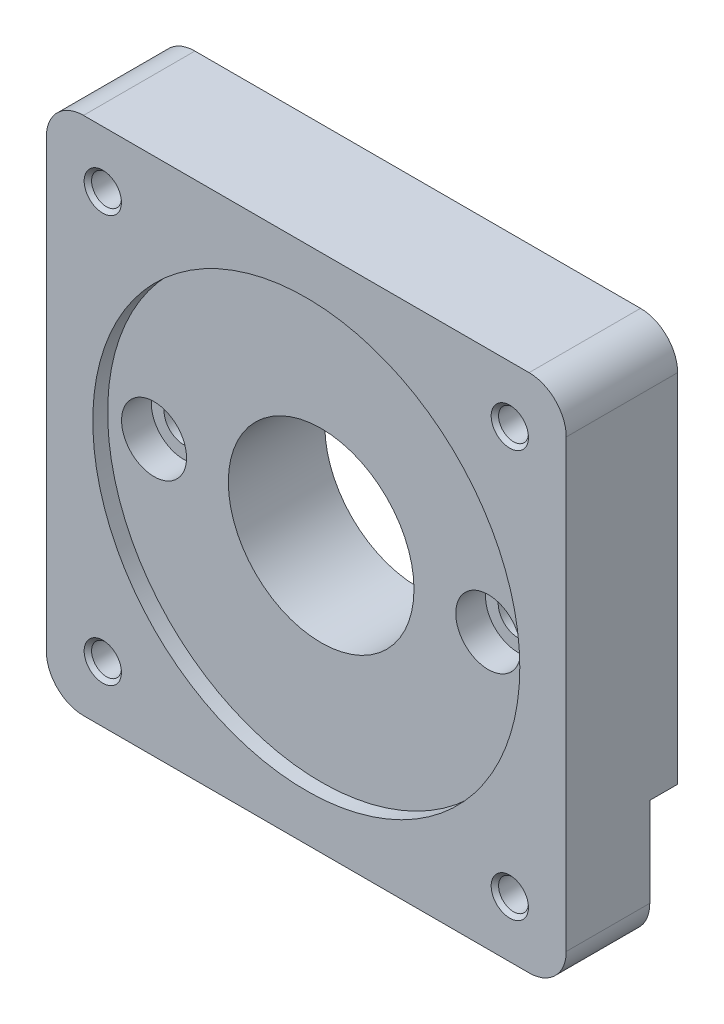
ISO-10303-21;
HEADER;
FILE_DESCRIPTION(('STEP AP214'),'2;1');
FILE_NAME('part.step','',(''),(''),'','','');
FILE_SCHEMA(('AUTOMOTIVE_DESIGN { 1 0 10303 214 1 1 1 1 }'));
ENDSEC;
DATA;
#1=APPLICATION_CONTEXT('core data for automotive mechanical design processes');
#2=APPLICATION_PROTOCOL_DEFINITION('international standard','automotive_design',2000,#1);
#3=PRODUCT_CONTEXT('',#1,'mechanical');
#4=PRODUCT('Part','Part','',(#3));
#5=PRODUCT_RELATED_PRODUCT_CATEGORY('part','',(#4));
#6=PRODUCT_DEFINITION_FORMATION('','',#4);
#7=PRODUCT_DEFINITION_CONTEXT('part definition',#1,'design');
#8=PRODUCT_DEFINITION('design','',#6,#7);
#9=PRODUCT_DEFINITION_SHAPE('','',#8);
#10=(LENGTH_UNIT() NAMED_UNIT(*) SI_UNIT(.MILLI.,.METRE.));
#11=(NAMED_UNIT(*) PLANE_ANGLE_UNIT() SI_UNIT($,.RADIAN.));
#12=(NAMED_UNIT(*) SI_UNIT($,.STERADIAN.) SOLID_ANGLE_UNIT());
#13=UNCERTAINTY_MEASURE_WITH_UNIT(LENGTH_MEASURE(1.E-05),#10,'distance_accuracy_value','');
#14=(GEOMETRIC_REPRESENTATION_CONTEXT(3) GLOBAL_UNCERTAINTY_ASSIGNED_CONTEXT((#13)) GLOBAL_UNIT_ASSIGNED_CONTEXT((#10,
#11,#12)) REPRESENTATION_CONTEXT('',''));
#15=CARTESIAN_POINT('',(0.,0.,0.));
#16=DIRECTION('',(0.,0.,1.));
#17=DIRECTION('',(1.,0.,0.));
#18=AXIS2_PLACEMENT_3D('',#15,#16,#17);
#19=CARTESIAN_POINT('',(44.45,44.45,19.05));
#20=DIRECTION('',(-1.,0.,0.));
#21=DIRECTION('',(0.,-1.,0.));
#22=AXIS2_PLACEMENT_3D('',#19,#20,#21);
#23=PLANE('',#22);
#24=DIRECTION('',(0.,1.,0.));
#25=VECTOR('',#24,1.);
#26=CARTESIAN_POINT('',(44.45,44.45,19.05));
#27=LINE('',#26,#25);
#28=CARTESIAN_POINT('',(44.45,-38.1,19.05));
#29=VERTEX_POINT('',#28);
#30=CARTESIAN_POINT('',(44.45,38.1,19.05));
#31=VERTEX_POINT('',#30);
#32=EDGE_CURVE('E160',#29,#31,#27,.T.);
#33=ORIENTED_EDGE('',*,*,#32,.F.);
#34=DIRECTION('',(0.,0.,-1.));
#35=VECTOR('',#34,1.);
#36=CARTESIAN_POINT('',(44.45,-38.1,19.05));
#37=LINE('',#36,#35);
#38=CARTESIAN_POINT('',(44.45,-38.1,4.7625));
#39=VERTEX_POINT('',#38);
#40=EDGE_CURVE('E121',#29,#39,#37,.T.);
#41=ORIENTED_EDGE('',*,*,#40,.T.);
#42=DIRECTION('',(0.,1.,0.));
#43=VECTOR('',#42,1.);
#44=CARTESIAN_POINT('',(44.45,-44.45,4.7625));
#45=LINE('',#44,#43);
#46=CARTESIAN_POINT('',(44.45,-22.86,4.7625));
#47=VERTEX_POINT('',#46);
#48=EDGE_CURVE('E113',#39,#47,#45,.T.);
#49=ORIENTED_EDGE('',*,*,#48,.T.);
#50=DIRECTION('',(0.,0.,-1.));
#51=VECTOR('',#50,1.);
#52=CARTESIAN_POINT('',(44.45,-22.86,0.));
#53=LINE('',#52,#51);
#54=CARTESIAN_POINT('',(44.45,-22.86,0.));
#55=VERTEX_POINT('',#54);
#56=EDGE_CURVE('E118',#47,#55,#53,.T.);
#57=ORIENTED_EDGE('',*,*,#56,.T.);
#58=DIRECTION('',(0.,1.,0.));
#59=VECTOR('',#58,1.);
#60=CARTESIAN_POINT('',(44.45,44.45,0.));
#61=LINE('',#60,#59);
#62=CARTESIAN_POINT('',(44.45,38.1,0.));
#63=VERTEX_POINT('',#62);
#64=EDGE_CURVE('E157',#55,#63,#61,.T.);
#65=ORIENTED_EDGE('',*,*,#64,.T.);
#66=DIRECTION('',(0.,0.,-1.));
#67=VECTOR('',#66,1.);
#68=CARTESIAN_POINT('',(44.45,38.1,19.05));
#69=LINE('',#68,#67);
#70=EDGE_CURVE('E199',#63,#31,#69,.F.);
#71=ORIENTED_EDGE('',*,*,#70,.T.);
#72=EDGE_LOOP('',(#33,#41,#49,#57,#65,#71));
#73=FACE_BOUND('',#72,.T.);
#74=ADVANCED_FACE('F34',(#73),#23,.F.);
#75=CARTESIAN_POINT('',(-44.45,44.45,19.05));
#76=DIRECTION('',(0.,-1.,0.));
#77=DIRECTION('',(0.,0.,-1.));
#78=AXIS2_PLACEMENT_3D('',#75,#76,#77);
#79=PLANE('',#78);
#80=DIRECTION('',(-1.,0.,0.));
#81=VECTOR('',#80,1.);
#82=CARTESIAN_POINT('',(-44.45,44.45,19.05));
#83=LINE('',#82,#81);
#84=CARTESIAN_POINT('',(38.1,44.45,19.05));
#85=VERTEX_POINT('',#84);
#86=CARTESIAN_POINT('',(-38.1,44.45,19.05));
#87=VERTEX_POINT('',#86);
#88=EDGE_CURVE('E163',#85,#87,#83,.T.);
#89=ORIENTED_EDGE('',*,*,#88,.F.);
#90=DIRECTION('',(0.,0.,-1.));
#91=VECTOR('',#90,1.);
#92=CARTESIAN_POINT('',(38.1,44.45,19.05));
#93=LINE('',#92,#91);
#94=CARTESIAN_POINT('',(38.1,44.45,0.));
#95=VERTEX_POINT('',#94);
#96=EDGE_CURVE('E204',#85,#95,#93,.T.);
#97=ORIENTED_EDGE('',*,*,#96,.T.);
#98=DIRECTION('',(-1.,0.,0.));
#99=VECTOR('',#98,1.);
#100=CARTESIAN_POINT('',(-44.45,44.45,0.));
#101=LINE('',#100,#99);
#102=CARTESIAN_POINT('',(-38.1,44.45,0.));
#103=VERTEX_POINT('',#102);
#104=EDGE_CURVE('E175',#95,#103,#101,.T.);
#105=ORIENTED_EDGE('',*,*,#104,.T.);
#106=DIRECTION('',(0.,0.,-1.));
#107=VECTOR('',#106,1.);
#108=CARTESIAN_POINT('',(-38.1,44.45,19.05));
#109=LINE('',#108,#107);
#110=EDGE_CURVE('E202',#103,#87,#109,.F.);
#111=ORIENTED_EDGE('',*,*,#110,.T.);
#112=EDGE_LOOP('',(#89,#97,#105,#111));
#113=FACE_BOUND('',#112,.T.);
#114=ADVANCED_FACE('F312',(#113),#79,.F.);
#115=CARTESIAN_POINT('',(-44.45,44.45,19.05));
#116=DIRECTION('',(1.,0.,0.));
#117=DIRECTION('',(0.,1.,0.));
#118=AXIS2_PLACEMENT_3D('',#115,#116,#117);
#119=PLANE('',#118);
#120=DIRECTION('',(0.,1.,0.));
#121=VECTOR('',#120,1.);
#122=CARTESIAN_POINT('',(-44.45,-44.45,4.7625));
#123=LINE('',#122,#121);
#124=CARTESIAN_POINT('',(-44.45,-38.1,4.7625));
#125=VERTEX_POINT('',#124);
#126=CARTESIAN_POINT('',(-44.45,-22.86,4.7625));
#127=VERTEX_POINT('',#126);
#128=EDGE_CURVE('E130',#125,#127,#123,.T.);
#129=ORIENTED_EDGE('',*,*,#128,.F.);
#130=DIRECTION('',(0.,0.,-1.));
#131=VECTOR('',#130,1.);
#132=CARTESIAN_POINT('',(-44.45,-38.1,19.05));
#133=LINE('',#132,#131);
#134=CARTESIAN_POINT('',(-44.45,-38.1,19.05));
#135=VERTEX_POINT('',#134);
#136=EDGE_CURVE('E189',#125,#135,#133,.F.);
#137=ORIENTED_EDGE('',*,*,#136,.T.);
#138=DIRECTION('',(0.,-1.,0.));
#139=VECTOR('',#138,1.);
#140=CARTESIAN_POINT('',(-44.45,44.45,19.05));
#141=LINE('',#140,#139);
#142=CARTESIAN_POINT('',(-44.45,38.1,19.05));
#143=VERTEX_POINT('',#142);
#144=EDGE_CURVE('E167',#143,#135,#141,.T.);
#145=ORIENTED_EDGE('',*,*,#144,.F.);
#146=DIRECTION('',(0.,0.,-1.));
#147=VECTOR('',#146,1.);
#148=CARTESIAN_POINT('',(-44.45,38.1,19.05));
#149=LINE('',#148,#147);
#150=CARTESIAN_POINT('',(-44.45,38.1,0.));
#151=VERTEX_POINT('',#150);
#152=EDGE_CURVE('E186',#143,#151,#149,.T.);
#153=ORIENTED_EDGE('',*,*,#152,.T.);
#154=DIRECTION('',(0.,-1.,0.));
#155=VECTOR('',#154,1.);
#156=CARTESIAN_POINT('',(-44.45,44.45,0.));
#157=LINE('',#156,#155);
#158=CARTESIAN_POINT('',(-44.45,-22.86,0.));
#159=VERTEX_POINT('',#158);
#160=EDGE_CURVE('E164',#151,#159,#157,.T.);
#161=ORIENTED_EDGE('',*,*,#160,.T.);
#162=DIRECTION('',(0.,0.,-1.));
#163=VECTOR('',#162,1.);
#164=CARTESIAN_POINT('',(-44.45,-22.86,0.));
#165=LINE('',#164,#163);
#166=EDGE_CURVE('E123',#127,#159,#165,.T.);
#167=ORIENTED_EDGE('',*,*,#166,.F.);
#168=EDGE_LOOP('',(#129,#137,#145,#153,#161,#167));
#169=FACE_BOUND('',#168,.T.);
#170=ADVANCED_FACE('F315',(#169),#119,.F.);
#171=CARTESIAN_POINT('',(-44.45,-44.45,19.05));
#172=DIRECTION('',(0.,1.,0.));
#173=DIRECTION('',(0.,0.,1.));
#174=AXIS2_PLACEMENT_3D('',#171,#172,#173);
#175=PLANE('',#174);
#176=DIRECTION('',(1.,0.,0.));
#177=VECTOR('',#176,1.);
#178=CARTESIAN_POINT('',(-44.45,-44.45,19.05));
#179=LINE('',#178,#177);
#180=CARTESIAN_POINT('',(-38.1,-44.45,19.05));
#181=VERTEX_POINT('',#180);
#182=CARTESIAN_POINT('',(38.1,-44.45,19.05));
#183=VERTEX_POINT('',#182);
#184=EDGE_CURVE('E170',#181,#183,#179,.T.);
#185=ORIENTED_EDGE('',*,*,#184,.F.);
#186=DIRECTION('',(0.,0.,-1.));
#187=VECTOR('',#186,1.);
#188=CARTESIAN_POINT('',(-38.1,-44.45,19.05));
#189=LINE('',#188,#187);
#190=CARTESIAN_POINT('',(-38.1,-44.45,4.7625));
#191=VERTEX_POINT('',#190);
#192=EDGE_CURVE('E179',#181,#191,#189,.T.);
#193=ORIENTED_EDGE('',*,*,#192,.T.);
#194=DIRECTION('',(-1.,0.,0.));
#195=VECTOR('',#194,1.);
#196=CARTESIAN_POINT('',(44.45,-44.45,4.7625));
#197=LINE('',#196,#195);
#198=CARTESIAN_POINT('',(38.1,-44.45,4.7625));
#199=VERTEX_POINT('',#198);
#200=EDGE_CURVE('E135',#199,#191,#197,.T.);
#201=ORIENTED_EDGE('',*,*,#200,.F.);
#202=DIRECTION('',(0.,0.,-1.));
#203=VECTOR('',#202,1.);
#204=CARTESIAN_POINT('',(38.1,-44.45,19.05));
#205=LINE('',#204,#203);
#206=EDGE_CURVE('E173',#199,#183,#205,.F.);
#207=ORIENTED_EDGE('',*,*,#206,.T.);
#208=EDGE_LOOP('',(#185,#193,#201,#207));
#209=FACE_BOUND('',#208,.T.);
#210=ADVANCED_FACE('F287',(#209),#175,.F.);
#211=CARTESIAN_POINT('',(0.,0.,19.05));
#212=DIRECTION('',(0.,0.,1.));
#213=DIRECTION('',(1.,0.,0.));
#214=AXIS2_PLACEMENT_3D('',#211,#212,#213);
#215=PLANE('',#214);
#216=CARTESIAN_POINT('',(34.8,-34.8,19.05));
#217=DIRECTION('',(0.,0.,1.));
#218=DIRECTION('',(1.,0.,0.));
#219=AXIS2_PLACEMENT_3D('',#216,#217,#218);
#220=CIRCLE('',#219,3.1877);
#221=CARTESIAN_POINT('',(37.9877,-34.8,19.05));
#222=VERTEX_POINT('',#221);
#223=EDGE_CURVE('E213',#222,#222,#220,.T.);
#224=ORIENTED_EDGE('',*,*,#223,.F.);
#225=EDGE_LOOP('',(#224));
#226=FACE_BOUND('',#225,.T.);
#227=CARTESIAN_POINT('',(-34.8,34.8,19.05));
#228=DIRECTION('',(0.,0.,1.));
#229=DIRECTION('',(1.,0.,0.));
#230=AXIS2_PLACEMENT_3D('',#227,#228,#229);
#231=CIRCLE('',#230,3.1877);
#232=CARTESIAN_POINT('',(-31.6123,34.8,19.05));
#233=VERTEX_POINT('',#232);
#234=EDGE_CURVE('E236',#233,#233,#231,.T.);
#235=ORIENTED_EDGE('',*,*,#234,.F.);
#236=EDGE_LOOP('',(#235));
#237=FACE_BOUND('',#236,.T.);
#238=CARTESIAN_POINT('',(-34.8,-34.8,19.05));
#239=DIRECTION('',(0.,0.,1.));
#240=DIRECTION('',(1.,0.,0.));
#241=AXIS2_PLACEMENT_3D('',#238,#239,#240);
#242=CIRCLE('',#241,3.1877);
#243=CARTESIAN_POINT('',(-31.6123,-34.8,19.05));
#244=VERTEX_POINT('',#243);
#245=EDGE_CURVE('E248',#244,#244,#242,.T.);
#246=ORIENTED_EDGE('',*,*,#245,.F.);
#247=EDGE_LOOP('',(#246));
#248=FACE_BOUND('',#247,.T.);
#249=CARTESIAN_POINT('',(34.8,34.8,19.05));
#250=DIRECTION('',(0.,0.,1.));
#251=DIRECTION('',(1.,0.,0.));
#252=AXIS2_PLACEMENT_3D('',#249,#250,#251);
#253=CIRCLE('',#252,3.1877);
#254=CARTESIAN_POINT('',(37.9877,34.8,19.05));
#255=VERTEX_POINT('',#254);
#256=EDGE_CURVE('E260',#255,#255,#253,.T.);
#257=ORIENTED_EDGE('',*,*,#256,.F.);
#258=EDGE_LOOP('',(#257));
#259=FACE_BOUND('',#258,.T.);
#260=CARTESIAN_POINT('',(0.,0.,19.05));
#261=DIRECTION('',(0.,0.,1.));
#262=DIRECTION('',(1.,0.,0.));
#263=AXIS2_PLACEMENT_3D('',#260,#261,#262);
#264=CIRCLE('',#263,36.51);
#265=CARTESIAN_POINT('',(36.51,0.,19.05));
#266=VERTEX_POINT('',#265);
#267=EDGE_CURVE('E151',#266,#266,#264,.T.);
#268=ORIENTED_EDGE('',*,*,#267,.F.);
#269=EDGE_LOOP('',(#268));
#270=FACE_BOUND('',#269,.T.);
#271=ORIENTED_EDGE('',*,*,#144,.T.);
#272=CARTESIAN_POINT('',(-38.1,-38.1,19.05));
#273=DIRECTION('',(0.,0.,1.));
#274=DIRECTION('',(1.,0.,0.));
#275=AXIS2_PLACEMENT_3D('',#272,#273,#274);
#276=CIRCLE('',#275,6.35);
#277=EDGE_CURVE('E197',#135,#181,#276,.T.);
#278=ORIENTED_EDGE('',*,*,#277,.T.);
#279=ORIENTED_EDGE('',*,*,#184,.T.);
#280=CARTESIAN_POINT('',(38.1,-38.1,19.05));
#281=DIRECTION('',(0.,0.,1.));
#282=DIRECTION('',(1.,0.,0.));
#283=AXIS2_PLACEMENT_3D('',#280,#281,#282);
#284=CIRCLE('',#283,6.35);
#285=EDGE_CURVE('E195',#183,#29,#284,.T.);
#286=ORIENTED_EDGE('',*,*,#285,.T.);
#287=ORIENTED_EDGE('',*,*,#32,.T.);
#288=CARTESIAN_POINT('',(38.1,38.1,19.05));
#289=DIRECTION('',(0.,0.,1.));
#290=DIRECTION('',(1.,0.,0.));
#291=AXIS2_PLACEMENT_3D('',#288,#289,#290);
#292=CIRCLE('',#291,6.35);
#293=EDGE_CURVE('E193',#31,#85,#292,.T.);
#294=ORIENTED_EDGE('',*,*,#293,.T.);
#295=ORIENTED_EDGE('',*,*,#88,.T.);
#296=CARTESIAN_POINT('',(-38.1,38.1,19.05));
#297=DIRECTION('',(0.,0.,1.));
#298=DIRECTION('',(1.,0.,0.));
#299=AXIS2_PLACEMENT_3D('',#296,#297,#298);
#300=CIRCLE('',#299,6.35);
#301=EDGE_CURVE('E191',#87,#143,#300,.T.);
#302=ORIENTED_EDGE('',*,*,#301,.T.);
#303=EDGE_LOOP('',(#271,#278,#279,#286,#287,#294,#295,#302));
#304=FACE_BOUND('',#303,.T.);
#305=ADVANCED_FACE('F283',(#226,#237,#248,#259,#270,#304),#215,.T.);
#306=CARTESIAN_POINT('',(0.,0.,0.));
#307=DIRECTION('',(0.,0.,1.));
#308=DIRECTION('',(1.,0.,0.));
#309=AXIS2_PLACEMENT_3D('',#306,#307,#308);
#310=PLANE('',#309);
#311=CARTESIAN_POINT('',(28.575,0.,0.));
#312=DIRECTION('',(0.,0.,1.));
#313=DIRECTION('',(1.,0.,0.));
#314=AXIS2_PLACEMENT_3D('',#311,#312,#313);
#315=CIRCLE('',#314,4.0132);
#316=CARTESIAN_POINT('',(32.5882,0.,0.));
#317=VERTEX_POINT('',#316);
#318=EDGE_CURVE('E555',#317,#317,#315,.T.);
#319=ORIENTED_EDGE('',*,*,#318,.T.);
#320=EDGE_LOOP('',(#319));
#321=FACE_BOUND('',#320,.T.);
#322=CARTESIAN_POINT('',(-28.575,0.,0.));
#323=DIRECTION('',(0.,0.,1.));
#324=DIRECTION('',(1.,0.,0.));
#325=AXIS2_PLACEMENT_3D('',#322,#323,#324);
#326=CIRCLE('',#325,4.01319999999999);
#327=CARTESIAN_POINT('',(-24.5618,0.,0.));
#328=VERTEX_POINT('',#327);
#329=EDGE_CURVE('E376',#328,#328,#326,.T.);
#330=ORIENTED_EDGE('',*,*,#329,.T.);
#331=EDGE_LOOP('',(#330));
#332=FACE_BOUND('',#331,.T.);
#333=CARTESIAN_POINT('',(-34.8,34.8,0.));
#334=DIRECTION('',(0.,0.,1.));
#335=DIRECTION('',(1.,0.,0.));
#336=AXIS2_PLACEMENT_3D('',#333,#334,#335);
#337=CIRCLE('',#336,3.18769999999999);
#338=CARTESIAN_POINT('',(-31.6123,34.8,0.));
#339=VERTEX_POINT('',#338);
#340=EDGE_CURVE('E233',#339,#339,#337,.T.);
#341=ORIENTED_EDGE('',*,*,#340,.T.);
#342=EDGE_LOOP('',(#341));
#343=FACE_BOUND('',#342,.T.);
#344=CARTESIAN_POINT('',(34.8,34.8,0.));
#345=DIRECTION('',(0.,0.,1.));
#346=DIRECTION('',(1.,0.,0.));
#347=AXIS2_PLACEMENT_3D('',#344,#345,#346);
#348=CIRCLE('',#347,3.18769999999999);
#349=CARTESIAN_POINT('',(37.9877,34.8,0.));
#350=VERTEX_POINT('',#349);
#351=EDGE_CURVE('E257',#350,#350,#348,.T.);
#352=ORIENTED_EDGE('',*,*,#351,.T.);
#353=EDGE_LOOP('',(#352));
#354=FACE_BOUND('',#353,.T.);
#355=CARTESIAN_POINT('',(0.,0.,0.));
#356=DIRECTION('',(0.,0.,1.));
#357=DIRECTION('',(1.,0.,0.));
#358=AXIS2_PLACEMENT_3D('',#355,#356,#357);
#359=CIRCLE('',#358,15.875);
#360=CARTESIAN_POINT('',(15.875,0.,0.));
#361=VERTEX_POINT('',#360);
#362=EDGE_CURVE('E148',#361,#361,#359,.T.);
#363=ORIENTED_EDGE('',*,*,#362,.T.);
#364=EDGE_LOOP('',(#363));
#365=FACE_BOUND('',#364,.T.);
#366=ORIENTED_EDGE('',*,*,#104,.F.);
#367=CARTESIAN_POINT('',(38.1,38.1,0.));
#368=DIRECTION('',(0.,0.,1.));
#369=DIRECTION('',(1.,0.,0.));
#370=AXIS2_PLACEMENT_3D('',#367,#368,#369);
#371=CIRCLE('',#370,6.35);
#372=EDGE_CURVE('E11',#95,#63,#371,.F.);
#373=ORIENTED_EDGE('',*,*,#372,.T.);
#374=ORIENTED_EDGE('',*,*,#64,.F.);
#375=DIRECTION('',(-1.,0.,0.));
#376=VECTOR('',#375,1.);
#377=CARTESIAN_POINT('',(44.45,-22.86,0.));
#378=LINE('',#377,#376);
#379=EDGE_CURVE('E134',#55,#159,#378,.T.);
#380=ORIENTED_EDGE('',*,*,#379,.T.);
#381=ORIENTED_EDGE('',*,*,#160,.F.);
#382=CARTESIAN_POINT('',(-38.1,38.1,0.));
#383=DIRECTION('',(0.,0.,1.));
#384=DIRECTION('',(1.,0.,0.));
#385=AXIS2_PLACEMENT_3D('',#382,#383,#384);
#386=CIRCLE('',#385,6.35);
#387=EDGE_CURVE('E43',#151,#103,#386,.F.);
#388=ORIENTED_EDGE('',*,*,#387,.T.);
#389=EDGE_LOOP('',(#366,#373,#374,#380,#381,#388));
#390=FACE_BOUND('',#389,.T.);
#391=ADVANCED_FACE('F286',(#321,#332,#343,#354,#365,#390),#310,.F.);
#392=CARTESIAN_POINT('',(0.,0.,16.51));
#393=DIRECTION('',(0.,0.,1.));
#394=DIRECTION('',(1.,0.,0.));
#395=AXIS2_PLACEMENT_3D('',#392,#393,#394);
#396=CYLINDRICAL_SURFACE('',#395,36.51);
#397=CARTESIAN_POINT('',(0.,0.,16.51));
#398=DIRECTION('',(0.,0.,1.));
#399=DIRECTION('',(1.,0.,0.));
#400=AXIS2_PLACEMENT_3D('',#397,#398,#399);
#401=CIRCLE('',#400,36.51);
#402=CARTESIAN_POINT('',(36.51,0.,16.51));
#403=VERTEX_POINT('',#402);
#404=EDGE_CURVE('E154',#403,#403,#401,.T.);
#405=ORIENTED_EDGE('',*,*,#404,.F.);
#406=EDGE_LOOP('',(#405));
#407=FACE_BOUND('',#406,.T.);
#408=ORIENTED_EDGE('',*,*,#267,.T.);
#409=EDGE_LOOP('',(#408));
#410=FACE_BOUND('',#409,.T.);
#411=ADVANCED_FACE('F317',(#407,#410),#396,.F.);
#412=CARTESIAN_POINT('',(0.,0.,16.51));
#413=DIRECTION('',(0.,0.,1.));
#414=DIRECTION('',(1.,0.,0.));
#415=AXIS2_PLACEMENT_3D('',#412,#413,#414);
#416=PLANE('',#415);
#417=CARTESIAN_POINT('',(28.575,0.,16.51));
#418=DIRECTION('',(0.,0.,1.));
#419=DIRECTION('',(1.,0.,0.));
#420=AXIS2_PLACEMENT_3D('',#417,#418,#419);
#421=CIRCLE('',#420,5.55625);
#422=CARTESIAN_POINT('',(34.13125,0.,16.51));
#423=VERTEX_POINT('',#422);
#424=EDGE_CURVE('E38',#423,#423,#421,.T.);
#425=ORIENTED_EDGE('',*,*,#424,.F.);
#426=EDGE_LOOP('',(#425));
#427=FACE_BOUND('',#426,.T.);
#428=CARTESIAN_POINT('',(-28.575,0.,16.51));
#429=DIRECTION('',(0.,0.,1.));
#430=DIRECTION('',(1.,0.,0.));
#431=AXIS2_PLACEMENT_3D('',#428,#429,#430);
#432=CIRCLE('',#431,5.55625);
#433=CARTESIAN_POINT('',(-23.01875,0.,16.51));
#434=VERTEX_POINT('',#433);
#435=EDGE_CURVE('E206',#434,#434,#432,.T.);
#436=ORIENTED_EDGE('',*,*,#435,.F.);
#437=EDGE_LOOP('',(#436));
#438=FACE_BOUND('',#437,.T.);
#439=CARTESIAN_POINT('',(0.,0.,16.51));
#440=DIRECTION('',(0.,0.,1.));
#441=DIRECTION('',(1.,0.,0.));
#442=AXIS2_PLACEMENT_3D('',#439,#440,#441);
#443=CIRCLE('',#442,15.875);
#444=CARTESIAN_POINT('',(15.875,0.,16.51));
#445=VERTEX_POINT('',#444);
#446=EDGE_CURVE('E146',#445,#445,#443,.T.);
#447=ORIENTED_EDGE('',*,*,#446,.F.);
#448=EDGE_LOOP('',(#447));
#449=FACE_BOUND('',#448,.T.);
#450=ORIENTED_EDGE('',*,*,#404,.T.);
#451=EDGE_LOOP('',(#450));
#452=FACE_BOUND('',#451,.T.);
#453=ADVANCED_FACE('F323',(#427,#438,#449,#452),#416,.T.);
#454=CARTESIAN_POINT('',(0.,0.,0.));
#455=DIRECTION('',(0.,0.,1.));
#456=DIRECTION('',(1.,0.,0.));
#457=AXIS2_PLACEMENT_3D('',#454,#455,#456);
#458=CYLINDRICAL_SURFACE('',#457,15.875);
#459=ORIENTED_EDGE('',*,*,#362,.F.);
#460=EDGE_LOOP('',(#459));
#461=FACE_BOUND('',#460,.T.);
#462=ORIENTED_EDGE('',*,*,#446,.T.);
#463=EDGE_LOOP('',(#462));
#464=FACE_BOUND('',#463,.T.);
#465=ADVANCED_FACE('F355',(#461,#464),#458,.F.);
#466=CARTESIAN_POINT('',(44.45,-22.86,0.));
#467=DIRECTION('',(0.,1.,0.));
#468=DIRECTION('',(-1.,0.,0.));
#469=AXIS2_PLACEMENT_3D('',#466,#467,#468);
#470=PLANE('',#469);
#471=ORIENTED_EDGE('',*,*,#166,.T.);
#472=ORIENTED_EDGE('',*,*,#379,.F.);
#473=ORIENTED_EDGE('',*,*,#56,.F.);
#474=DIRECTION('',(-1.,0.,0.));
#475=VECTOR('',#474,1.);
#476=CARTESIAN_POINT('',(44.45,-22.86,4.7625));
#477=LINE('',#476,#475);
#478=EDGE_CURVE('E126',#47,#127,#477,.T.);
#479=ORIENTED_EDGE('',*,*,#478,.T.);
#480=EDGE_LOOP('',(#471,#472,#473,#479));
#481=FACE_BOUND('',#480,.T.);
#482=ADVANCED_FACE('F137',(#481),#470,.F.);
#483=CARTESIAN_POINT('',(44.45,-44.45,4.7625));
#484=DIRECTION('',(0.,0.,1.));
#485=DIRECTION('',(1.,0.,0.));
#486=AXIS2_PLACEMENT_3D('',#483,#484,#485);
#487=PLANE('',#486);
#488=CARTESIAN_POINT('',(34.8,-34.8,4.7625));
#489=DIRECTION('',(0.,0.,1.));
#490=DIRECTION('',(1.,0.,0.));
#491=AXIS2_PLACEMENT_3D('',#488,#489,#490);
#492=CIRCLE('',#491,3.18769999999999);
#493=CARTESIAN_POINT('',(37.9877,-34.8,4.7625));
#494=VERTEX_POINT('',#493);
#495=EDGE_CURVE('E208',#494,#494,#492,.T.);
#496=ORIENTED_EDGE('',*,*,#495,.T.);
#497=EDGE_LOOP('',(#496));
#498=FACE_BOUND('',#497,.T.);
#499=CARTESIAN_POINT('',(-34.8,-34.8,4.7625));
#500=DIRECTION('',(0.,0.,1.));
#501=DIRECTION('',(1.,0.,0.));
#502=AXIS2_PLACEMENT_3D('',#499,#500,#501);
#503=CIRCLE('',#502,3.18769999999999);
#504=CARTESIAN_POINT('',(-31.6123,-34.8,4.7625));
#505=VERTEX_POINT('',#504);
#506=EDGE_CURVE('E245',#505,#505,#503,.T.);
#507=ORIENTED_EDGE('',*,*,#506,.T.);
#508=EDGE_LOOP('',(#507));
#509=FACE_BOUND('',#508,.T.);
#510=ORIENTED_EDGE('',*,*,#200,.T.);
#511=CARTESIAN_POINT('',(-38.1,-38.1,4.7625));
#512=DIRECTION('',(0.,0.,1.));
#513=DIRECTION('',(1.,0.,0.));
#514=AXIS2_PLACEMENT_3D('',#511,#512,#513);
#515=CIRCLE('',#514,6.35);
#516=EDGE_CURVE('E184',#191,#125,#515,.F.);
#517=ORIENTED_EDGE('',*,*,#516,.T.);
#518=ORIENTED_EDGE('',*,*,#128,.T.);
#519=ORIENTED_EDGE('',*,*,#478,.F.);
#520=ORIENTED_EDGE('',*,*,#48,.F.);
#521=CARTESIAN_POINT('',(38.1,-38.1,4.7625));
#522=DIRECTION('',(0.,0.,1.));
#523=DIRECTION('',(1.,0.,0.));
#524=AXIS2_PLACEMENT_3D('',#521,#522,#523);
#525=CIRCLE('',#524,6.35);
#526=EDGE_CURVE('E182',#39,#199,#525,.F.);
#527=ORIENTED_EDGE('',*,*,#526,.T.);
#528=EDGE_LOOP('',(#510,#517,#518,#519,#520,#527));
#529=FACE_BOUND('',#528,.T.);
#530=ADVANCED_FACE('F128',(#498,#509,#529),#487,.F.);
#531=CARTESIAN_POINT('',(-38.1,-38.1,19.05));
#532=DIRECTION('',(0.,0.,-1.));
#533=DIRECTION('',(-1.,0.,0.));
#534=AXIS2_PLACEMENT_3D('',#531,#532,#533);
#535=CYLINDRICAL_SURFACE('',#534,6.35);
#536=ORIENTED_EDGE('',*,*,#277,.F.);
#537=ORIENTED_EDGE('',*,*,#136,.F.);
#538=ORIENTED_EDGE('',*,*,#516,.F.);
#539=ORIENTED_EDGE('',*,*,#192,.F.);
#540=EDGE_LOOP('',(#536,#537,#538,#539));
#541=FACE_BOUND('',#540,.T.);
#542=ADVANCED_FACE('F301',(#541),#535,.T.);
#543=CARTESIAN_POINT('',(38.1,-38.1,19.05));
#544=DIRECTION('',(0.,0.,-1.));
#545=DIRECTION('',(-1.,0.,0.));
#546=AXIS2_PLACEMENT_3D('',#543,#544,#545);
#547=CYLINDRICAL_SURFACE('',#546,6.35);
#548=ORIENTED_EDGE('',*,*,#285,.F.);
#549=ORIENTED_EDGE('',*,*,#206,.F.);
#550=ORIENTED_EDGE('',*,*,#526,.F.);
#551=ORIENTED_EDGE('',*,*,#40,.F.);
#552=EDGE_LOOP('',(#548,#549,#550,#551));
#553=FACE_BOUND('',#552,.T.);
#554=ADVANCED_FACE('F307',(#553),#547,.T.);
#555=CARTESIAN_POINT('',(38.1,38.1,19.05));
#556=DIRECTION('',(0.,0.,-1.));
#557=DIRECTION('',(-1.,0.,0.));
#558=AXIS2_PLACEMENT_3D('',#555,#556,#557);
#559=CYLINDRICAL_SURFACE('',#558,6.35);
#560=ORIENTED_EDGE('',*,*,#293,.F.);
#561=ORIENTED_EDGE('',*,*,#70,.F.);
#562=ORIENTED_EDGE('',*,*,#372,.F.);
#563=ORIENTED_EDGE('',*,*,#96,.F.);
#564=EDGE_LOOP('',(#560,#561,#562,#563));
#565=FACE_BOUND('',#564,.T.);
#566=ADVANCED_FACE('F309',(#565),#559,.T.);
#567=CARTESIAN_POINT('',(-38.1,38.1,19.05));
#568=DIRECTION('',(0.,0.,-1.));
#569=DIRECTION('',(-1.,0.,0.));
#570=AXIS2_PLACEMENT_3D('',#567,#568,#569);
#571=CYLINDRICAL_SURFACE('',#570,6.35);
#572=ORIENTED_EDGE('',*,*,#301,.F.);
#573=ORIENTED_EDGE('',*,*,#110,.F.);
#574=ORIENTED_EDGE('',*,*,#387,.F.);
#575=ORIENTED_EDGE('',*,*,#152,.F.);
#576=EDGE_LOOP('',(#572,#573,#574,#575));
#577=FACE_BOUND('',#576,.T.);
#578=ADVANCED_FACE('F36',(#577),#571,.T.);
#579=CARTESIAN_POINT('',(34.8,34.8,0.635));
#580=DIRECTION('',(0.,0.,-1.));
#581=DIRECTION('',(-1.,0.,0.));
#582=AXIS2_PLACEMENT_3D('',#579,#580,#581);
#583=CONICAL_SURFACE('',#582,2.5527,0.785398163397446);
#584=ORIENTED_EDGE('',*,*,#351,.F.);
#585=EDGE_LOOP('',(#584));
#586=FACE_BOUND('',#585,.T.);
#587=CARTESIAN_POINT('',(34.8,34.8,0.635));
#588=DIRECTION('',(0.,0.,1.));
#589=DIRECTION('',(1.,0.,0.));
#590=AXIS2_PLACEMENT_3D('',#587,#588,#589);
#591=CIRCLE('',#590,2.5527);
#592=CARTESIAN_POINT('',(37.3527,34.8,0.635));
#593=VERTEX_POINT('',#592);
#594=EDGE_CURVE('E144',#593,#593,#591,.T.);
#595=ORIENTED_EDGE('',*,*,#594,.T.);
#596=EDGE_LOOP('',(#595));
#597=FACE_BOUND('',#596,.T.);
#598=ADVANCED_FACE('F268',(#586,#597),#583,.F.);
#599=CARTESIAN_POINT('',(34.8,34.8,19.05));
#600=DIRECTION('',(0.,0.,1.));
#601=DIRECTION('',(1.,0.,0.));
#602=AXIS2_PLACEMENT_3D('',#599,#600,#601);
#603=CYLINDRICAL_SURFACE('',#602,2.5527);
#604=ORIENTED_EDGE('',*,*,#594,.F.);
#605=EDGE_LOOP('',(#604));
#606=FACE_BOUND('',#605,.T.);
#607=CARTESIAN_POINT('',(34.8,34.8,18.415));
#608=DIRECTION('',(0.,0.,1.));
#609=DIRECTION('',(1.,0.,0.));
#610=AXIS2_PLACEMENT_3D('',#607,#608,#609);
#611=CIRCLE('',#610,2.5527);
#612=CARTESIAN_POINT('',(37.3527,34.8,18.415));
#613=VERTEX_POINT('',#612);
#614=EDGE_CURVE('E263',#613,#613,#611,.T.);
#615=ORIENTED_EDGE('',*,*,#614,.T.);
#616=EDGE_LOOP('',(#615));
#617=FACE_BOUND('',#616,.T.);
#618=ADVANCED_FACE('F270',(#606,#617),#603,.F.);
#619=CARTESIAN_POINT('',(34.8,34.8,19.05));
#620=DIRECTION('',(0.,0.,1.));
#621=DIRECTION('',(1.,0.,0.));
#622=AXIS2_PLACEMENT_3D('',#619,#620,#621);
#623=CONICAL_SURFACE('',#622,3.1877,0.785398163397448);
#624=ORIENTED_EDGE('',*,*,#614,.F.);
#625=EDGE_LOOP('',(#624));
#626=FACE_BOUND('',#625,.T.);
#627=ORIENTED_EDGE('',*,*,#256,.T.);
#628=EDGE_LOOP('',(#627));
#629=FACE_BOUND('',#628,.T.);
#630=ADVANCED_FACE('F273',(#626,#629),#623,.F.);
#631=CARTESIAN_POINT('',(-34.8,-34.8,5.3975));
#632=DIRECTION('',(0.,0.,-1.));
#633=DIRECTION('',(-1.,0.,0.));
#634=AXIS2_PLACEMENT_3D('',#631,#632,#633);
#635=CONICAL_SURFACE('',#634,2.5527,0.785398163397443);
#636=ORIENTED_EDGE('',*,*,#506,.F.);
#637=EDGE_LOOP('',(#636));
#638=FACE_BOUND('',#637,.T.);
#639=CARTESIAN_POINT('',(-34.8,-34.8,5.3975));
#640=DIRECTION('',(0.,0.,1.));
#641=DIRECTION('',(1.,0.,0.));
#642=AXIS2_PLACEMENT_3D('',#639,#640,#641);
#643=CIRCLE('',#642,2.5527);
#644=CARTESIAN_POINT('',(-32.2473,-34.8,5.3975));
#645=VERTEX_POINT('',#644);
#646=EDGE_CURVE('E254',#645,#645,#643,.T.);
#647=ORIENTED_EDGE('',*,*,#646,.T.);
#648=EDGE_LOOP('',(#647));
#649=FACE_BOUND('',#648,.T.);
#650=ADVANCED_FACE('F279',(#638,#649),#635,.F.);
#651=CARTESIAN_POINT('',(-34.8,-34.8,19.05));
#652=DIRECTION('',(0.,0.,1.));
#653=DIRECTION('',(1.,0.,0.));
#654=AXIS2_PLACEMENT_3D('',#651,#652,#653);
#655=CYLINDRICAL_SURFACE('',#654,2.5527);
#656=ORIENTED_EDGE('',*,*,#646,.F.);
#657=EDGE_LOOP('',(#656));
#658=FACE_BOUND('',#657,.T.);
#659=CARTESIAN_POINT('',(-34.8,-34.8,18.415));
#660=DIRECTION('',(0.,0.,1.));
#661=DIRECTION('',(1.,0.,0.));
#662=AXIS2_PLACEMENT_3D('',#659,#660,#661);
#663=CIRCLE('',#662,2.5527);
#664=CARTESIAN_POINT('',(-32.2473,-34.8,18.415));
#665=VERTEX_POINT('',#664);
#666=EDGE_CURVE('E251',#665,#665,#663,.T.);
#667=ORIENTED_EDGE('',*,*,#666,.T.);
#668=EDGE_LOOP('',(#667));
#669=FACE_BOUND('',#668,.T.);
#670=ADVANCED_FACE('F444',(#658,#669),#655,.F.);
#671=CARTESIAN_POINT('',(-34.8,-34.8,19.05));
#672=DIRECTION('',(0.,0.,1.));
#673=DIRECTION('',(1.,0.,0.));
#674=AXIS2_PLACEMENT_3D('',#671,#672,#673);
#675=CONICAL_SURFACE('',#674,3.1877,0.785398163397448);
#676=ORIENTED_EDGE('',*,*,#666,.F.);
#677=EDGE_LOOP('',(#676));
#678=FACE_BOUND('',#677,.T.);
#679=ORIENTED_EDGE('',*,*,#245,.T.);
#680=EDGE_LOOP('',(#679));
#681=FACE_BOUND('',#680,.T.);
#682=ADVANCED_FACE('F440',(#678,#681),#675,.F.);
#683=CARTESIAN_POINT('',(-34.8,34.8,0.635));
#684=DIRECTION('',(0.,0.,-1.));
#685=DIRECTION('',(-1.,0.,0.));
#686=AXIS2_PLACEMENT_3D('',#683,#684,#685);
#687=CONICAL_SURFACE('',#686,2.5527,0.785398163397446);
#688=ORIENTED_EDGE('',*,*,#340,.F.);
#689=EDGE_LOOP('',(#688));
#690=FACE_BOUND('',#689,.T.);
#691=CARTESIAN_POINT('',(-34.8,34.8,0.635));
#692=DIRECTION('',(0.,0.,1.));
#693=DIRECTION('',(1.,0.,0.));
#694=AXIS2_PLACEMENT_3D('',#691,#692,#693);
#695=CIRCLE('',#694,2.5527);
#696=CARTESIAN_POINT('',(-32.2473,34.8,0.635));
#697=VERTEX_POINT('',#696);
#698=EDGE_CURVE('E242',#697,#697,#695,.T.);
#699=ORIENTED_EDGE('',*,*,#698,.T.);
#700=EDGE_LOOP('',(#699));
#701=FACE_BOUND('',#700,.T.);
#702=ADVANCED_FACE('F436',(#690,#701),#687,.F.);
#703=CARTESIAN_POINT('',(-34.8,34.8,19.05));
#704=DIRECTION('',(0.,0.,1.));
#705=DIRECTION('',(1.,0.,0.));
#706=AXIS2_PLACEMENT_3D('',#703,#704,#705);
#707=CYLINDRICAL_SURFACE('',#706,2.5527);
#708=ORIENTED_EDGE('',*,*,#698,.F.);
#709=EDGE_LOOP('',(#708));
#710=FACE_BOUND('',#709,.T.);
#711=CARTESIAN_POINT('',(-34.8,34.8,18.415));
#712=DIRECTION('',(0.,0.,1.));
#713=DIRECTION('',(1.,0.,0.));
#714=AXIS2_PLACEMENT_3D('',#711,#712,#713);
#715=CIRCLE('',#714,2.5527);
#716=CARTESIAN_POINT('',(-32.2473,34.8,18.415));
#717=VERTEX_POINT('',#716);
#718=EDGE_CURVE('E239',#717,#717,#715,.T.);
#719=ORIENTED_EDGE('',*,*,#718,.T.);
#720=EDGE_LOOP('',(#719));
#721=FACE_BOUND('',#720,.T.);
#722=ADVANCED_FACE('F432',(#710,#721),#707,.F.);
#723=CARTESIAN_POINT('',(-34.8,34.8,19.05));
#724=DIRECTION('',(0.,0.,1.));
#725=DIRECTION('',(1.,0.,0.));
#726=AXIS2_PLACEMENT_3D('',#723,#724,#725);
#727=CONICAL_SURFACE('',#726,3.1877,0.785398163397448);
#728=ORIENTED_EDGE('',*,*,#718,.F.);
#729=EDGE_LOOP('',(#728));
#730=FACE_BOUND('',#729,.T.);
#731=ORIENTED_EDGE('',*,*,#234,.T.);
#732=EDGE_LOOP('',(#731));
#733=FACE_BOUND('',#732,.T.);
#734=ADVANCED_FACE('F428',(#730,#733),#727,.F.);
#735=CARTESIAN_POINT('',(34.8,-34.8,5.3975));
#736=DIRECTION('',(0.,0.,-1.));
#737=DIRECTION('',(-1.,0.,0.));
#738=AXIS2_PLACEMENT_3D('',#735,#736,#737);
#739=CONICAL_SURFACE('',#738,2.5527,0.785398163397443);
#740=ORIENTED_EDGE('',*,*,#495,.F.);
#741=EDGE_LOOP('',(#740));
#742=FACE_BOUND('',#741,.T.);
#743=CARTESIAN_POINT('',(34.8,-34.8,5.3975));
#744=DIRECTION('',(0.,0.,1.));
#745=DIRECTION('',(1.,0.,0.));
#746=AXIS2_PLACEMENT_3D('',#743,#744,#745);
#747=CIRCLE('',#746,2.5527);
#748=CARTESIAN_POINT('',(37.3527,-34.8,5.3975));
#749=VERTEX_POINT('',#748);
#750=EDGE_CURVE('E230',#749,#749,#747,.T.);
#751=ORIENTED_EDGE('',*,*,#750,.T.);
#752=EDGE_LOOP('',(#751));
#753=FACE_BOUND('',#752,.T.);
#754=ADVANCED_FACE('F424',(#742,#753),#739,.F.);
#755=CARTESIAN_POINT('',(34.8,-34.8,19.05));
#756=DIRECTION('',(0.,0.,1.));
#757=DIRECTION('',(1.,0.,0.));
#758=AXIS2_PLACEMENT_3D('',#755,#756,#757);
#759=CYLINDRICAL_SURFACE('',#758,2.5527);
#760=ORIENTED_EDGE('',*,*,#750,.F.);
#761=EDGE_LOOP('',(#760));
#762=FACE_BOUND('',#761,.T.);
#763=CARTESIAN_POINT('',(34.8,-34.8,18.415));
#764=DIRECTION('',(0.,0.,1.));
#765=DIRECTION('',(1.,0.,0.));
#766=AXIS2_PLACEMENT_3D('',#763,#764,#765);
#767=CIRCLE('',#766,2.5527);
#768=CARTESIAN_POINT('',(37.3527,-34.8,18.415));
#769=VERTEX_POINT('',#768);
#770=EDGE_CURVE('E227',#769,#769,#767,.T.);
#771=ORIENTED_EDGE('',*,*,#770,.T.);
#772=EDGE_LOOP('',(#771));
#773=FACE_BOUND('',#772,.T.);
#774=ADVANCED_FACE('F420',(#762,#773),#759,.F.);
#775=CARTESIAN_POINT('',(34.8,-34.8,19.05));
#776=DIRECTION('',(0.,0.,1.));
#777=DIRECTION('',(1.,0.,0.));
#778=AXIS2_PLACEMENT_3D('',#775,#776,#777);
#779=CONICAL_SURFACE('',#778,3.1877,0.785398163397448);
#780=ORIENTED_EDGE('',*,*,#770,.F.);
#781=EDGE_LOOP('',(#780));
#782=FACE_BOUND('',#781,.T.);
#783=ORIENTED_EDGE('',*,*,#223,.T.);
#784=EDGE_LOOP('',(#783));
#785=FACE_BOUND('',#784,.T.);
#786=ADVANCED_FACE('F416',(#782,#785),#779,.F.);
#787=CARTESIAN_POINT('',(-28.575,0.,0.635000000000004));
#788=DIRECTION('',(0.,0.,-1.));
#789=DIRECTION('',(-1.,0.,0.));
#790=AXIS2_PLACEMENT_3D('',#787,#788,#789);
#791=CONICAL_SURFACE('',#790,3.37819999999999,0.785398163397446);
#792=ORIENTED_EDGE('',*,*,#329,.F.);
#793=EDGE_LOOP('',(#792));
#794=FACE_BOUND('',#793,.T.);
#795=CARTESIAN_POINT('',(-28.575,0.,0.635000000000004));
#796=DIRECTION('',(0.,0.,1.));
#797=DIRECTION('',(1.,0.,0.));
#798=AXIS2_PLACEMENT_3D('',#795,#796,#797);
#799=CIRCLE('',#798,3.37819999999999);
#800=CARTESIAN_POINT('',(-25.1968,0.,0.635000000000004));
#801=VERTEX_POINT('',#800);
#802=EDGE_CURVE('E209',#801,#801,#799,.T.);
#803=ORIENTED_EDGE('',*,*,#802,.T.);
#804=EDGE_LOOP('',(#803));
#805=FACE_BOUND('',#804,.T.);
#806=ADVANCED_FACE('F412',(#794,#805),#791,.F.);
#807=CARTESIAN_POINT('',(-28.575,0.,19.05));
#808=DIRECTION('',(0.,0.,1.));
#809=DIRECTION('',(1.,0.,0.));
#810=AXIS2_PLACEMENT_3D('',#807,#808,#809);
#811=CYLINDRICAL_SURFACE('',#810,3.3782);
#812=ORIENTED_EDGE('',*,*,#802,.F.);
#813=EDGE_LOOP('',(#812));
#814=FACE_BOUND('',#813,.T.);
#815=CARTESIAN_POINT('',(-28.575,0.,11.43));
#816=DIRECTION('',(0.,0.,1.));
#817=DIRECTION('',(1.,0.,0.));
#818=AXIS2_PLACEMENT_3D('',#815,#816,#817);
#819=CIRCLE('',#818,3.3782);
#820=CARTESIAN_POINT('',(-25.1968,0.,11.43));
#821=VERTEX_POINT('',#820);
#822=EDGE_CURVE('E216',#821,#821,#819,.T.);
#823=ORIENTED_EDGE('',*,*,#822,.T.);
#824=EDGE_LOOP('',(#823));
#825=FACE_BOUND('',#824,.T.);
#826=ADVANCED_FACE('F405',(#814,#825),#811,.F.);
#827=CARTESIAN_POINT('',(-23.01875,0.,11.43));
#828=DIRECTION('',(0.,0.,-1.));
#829=DIRECTION('',(-1.,0.,0.));
#830=AXIS2_PLACEMENT_3D('',#827,#828,#829);
#831=PLANE('',#830);
#832=ORIENTED_EDGE('',*,*,#822,.F.);
#833=EDGE_LOOP('',(#832));
#834=FACE_BOUND('',#833,.T.);
#835=CARTESIAN_POINT('',(-28.575,0.,11.43));
#836=DIRECTION('',(0.,0.,1.));
#837=DIRECTION('',(1.,0.,0.));
#838=AXIS2_PLACEMENT_3D('',#835,#836,#837);
#839=CIRCLE('',#838,5.55625);
#840=CARTESIAN_POINT('',(-23.01875,0.,11.43));
#841=VERTEX_POINT('',#840);
#842=EDGE_CURVE('E221',#841,#841,#839,.T.);
#843=ORIENTED_EDGE('',*,*,#842,.T.);
#844=EDGE_LOOP('',(#843));
#845=FACE_BOUND('',#844,.T.);
#846=ADVANCED_FACE('F392',(#834,#845),#831,.F.);
#847=CARTESIAN_POINT('',(-28.575,0.,19.05));
#848=DIRECTION('',(0.,0.,1.));
#849=DIRECTION('',(1.,0.,0.));
#850=AXIS2_PLACEMENT_3D('',#847,#848,#849);
#851=CYLINDRICAL_SURFACE('',#850,5.55625);
#852=ORIENTED_EDGE('',*,*,#435,.T.);
#853=EDGE_LOOP('',(#852));
#854=FACE_BOUND('',#853,.T.);
#855=ORIENTED_EDGE('',*,*,#842,.F.);
#856=EDGE_LOOP('',(#855));
#857=FACE_BOUND('',#856,.T.);
#858=ADVANCED_FACE('F394',(#854,#857),#851,.F.);
#859=CARTESIAN_POINT('',(28.575,0.,0.635000000000004));
#860=DIRECTION('',(0.,0.,-1.));
#861=DIRECTION('',(-1.,0.,0.));
#862=AXIS2_PLACEMENT_3D('',#859,#860,#861);
#863=CONICAL_SURFACE('',#862,3.37819999999999,0.785398163397448);
#864=ORIENTED_EDGE('',*,*,#318,.F.);
#865=EDGE_LOOP('',(#864));
#866=FACE_BOUND('',#865,.T.);
#867=CARTESIAN_POINT('',(28.575,0.,0.635000000000004));
#868=DIRECTION('',(0.,0.,1.));
#869=DIRECTION('',(1.,0.,0.));
#870=AXIS2_PLACEMENT_3D('',#867,#868,#869);
#871=CIRCLE('',#870,3.37819999999999);
#872=CARTESIAN_POINT('',(31.9532,0.,0.635000000000004));
#873=VERTEX_POINT('',#872);
#874=EDGE_CURVE('E377',#873,#873,#871,.T.);
#875=ORIENTED_EDGE('',*,*,#874,.T.);
#876=EDGE_LOOP('',(#875));
#877=FACE_BOUND('',#876,.T.);
#878=ADVANCED_FACE('F396',(#866,#877),#863,.F.);
#879=CARTESIAN_POINT('',(28.575,0.,19.05));
#880=DIRECTION('',(0.,0.,1.));
#881=DIRECTION('',(1.,0.,0.));
#882=AXIS2_PLACEMENT_3D('',#879,#880,#881);
#883=CYLINDRICAL_SURFACE('',#882,3.3782);
#884=ORIENTED_EDGE('',*,*,#874,.F.);
#885=EDGE_LOOP('',(#884));
#886=FACE_BOUND('',#885,.T.);
#887=CARTESIAN_POINT('',(28.575,0.,11.43));
#888=DIRECTION('',(0.,0.,1.));
#889=DIRECTION('',(1.,0.,0.));
#890=AXIS2_PLACEMENT_3D('',#887,#888,#889);
#891=CIRCLE('',#890,3.3782);
#892=CARTESIAN_POINT('',(31.9532,0.,11.43));
#893=VERTEX_POINT('',#892);
#894=EDGE_CURVE('E381',#893,#893,#891,.T.);
#895=ORIENTED_EDGE('',*,*,#894,.T.);
#896=EDGE_LOOP('',(#895));
#897=FACE_BOUND('',#896,.T.);
#898=ADVANCED_FACE('F402',(#886,#897),#883,.F.);
#899=CARTESIAN_POINT('',(34.13125,0.,11.43));
#900=DIRECTION('',(0.,0.,-1.));
#901=DIRECTION('',(-1.,0.,0.));
#902=AXIS2_PLACEMENT_3D('',#899,#900,#901);
#903=PLANE('',#902);
#904=ORIENTED_EDGE('',*,*,#894,.F.);
#905=EDGE_LOOP('',(#904));
#906=FACE_BOUND('',#905,.T.);
#907=CARTESIAN_POINT('',(28.575,0.,11.43));
#908=DIRECTION('',(0.,0.,1.));
#909=DIRECTION('',(1.,0.,0.));
#910=AXIS2_PLACEMENT_3D('',#907,#908,#909);
#911=CIRCLE('',#910,5.55625);
#912=CARTESIAN_POINT('',(34.13125,0.,11.43));
#913=VERTEX_POINT('',#912);
#914=EDGE_CURVE('E386',#913,#913,#911,.T.);
#915=ORIENTED_EDGE('',*,*,#914,.T.);
#916=EDGE_LOOP('',(#915));
#917=FACE_BOUND('',#916,.T.);
#918=ADVANCED_FACE('F529',(#906,#917),#903,.F.);
#919=CARTESIAN_POINT('',(28.575,0.,19.05));
#920=DIRECTION('',(0.,0.,1.));
#921=DIRECTION('',(1.,0.,0.));
#922=AXIS2_PLACEMENT_3D('',#919,#920,#921);
#923=CYLINDRICAL_SURFACE('',#922,5.55625);
#924=ORIENTED_EDGE('',*,*,#424,.T.);
#925=EDGE_LOOP('',(#924));
#926=FACE_BOUND('',#925,.T.);
#927=ORIENTED_EDGE('',*,*,#914,.F.);
#928=EDGE_LOOP('',(#927));
#929=FACE_BOUND('',#928,.T.);
#930=ADVANCED_FACE('F538',(#926,#929),#923,.F.);
#931=CLOSED_SHELL('',(#74,#114,#170,#210,#305,#391,#411,#453,#465,#482,#530,#542,#554,#566,#578,
#598,#618,#630,#650,#670,#682,#702,#722,#734,#754,#774,#786,#806,#826,#846,#858,#878,#898,#918,#930));
#932=MANIFOLD_SOLID_BREP('B2',#931);
#933=ADVANCED_BREP_SHAPE_REPRESENTATION('',(#18,#932),#14);
#934=SHAPE_DEFINITION_REPRESENTATION(#9,#933);
ENDSEC;
END-ISO-10303-21;
